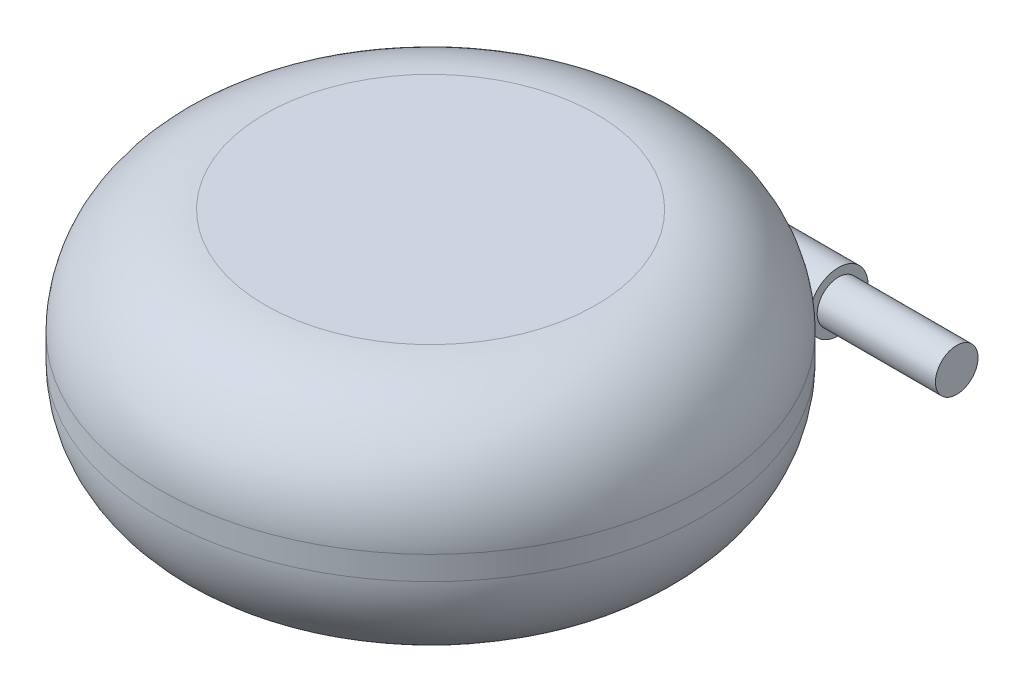
ISO-10303-21;
HEADER;
FILE_DESCRIPTION(('STEP AP214'),'2;1');
FILE_NAME('part.step','',(''),(''),'','','');
FILE_SCHEMA(('AUTOMOTIVE_DESIGN { 1 0 10303 214 1 1 1 1 }'));
ENDSEC;
DATA;
#1=APPLICATION_CONTEXT('core data for automotive mechanical design processes');
#2=APPLICATION_PROTOCOL_DEFINITION('international standard','automotive_design',2000,#1);
#3=PRODUCT_CONTEXT('',#1,'mechanical');
#4=PRODUCT('Part','Part','',(#3));
#5=PRODUCT_RELATED_PRODUCT_CATEGORY('part','',(#4));
#6=PRODUCT_DEFINITION_FORMATION('','',#4);
#7=PRODUCT_DEFINITION_CONTEXT('part definition',#1,'design');
#8=PRODUCT_DEFINITION('design','',#6,#7);
#9=PRODUCT_DEFINITION_SHAPE('','',#8);
#10=(LENGTH_UNIT() NAMED_UNIT(*) SI_UNIT(.MILLI.,.METRE.));
#11=(NAMED_UNIT(*) PLANE_ANGLE_UNIT() SI_UNIT($,.RADIAN.));
#12=(NAMED_UNIT(*) SI_UNIT($,.STERADIAN.) SOLID_ANGLE_UNIT());
#13=UNCERTAINTY_MEASURE_WITH_UNIT(LENGTH_MEASURE(1.E-05),#10,'distance_accuracy_value','');
#14=(GEOMETRIC_REPRESENTATION_CONTEXT(3) GLOBAL_UNCERTAINTY_ASSIGNED_CONTEXT((#13)) GLOBAL_UNIT_ASSIGNED_CONTEXT((#10,
#11,#12)) REPRESENTATION_CONTEXT('',''));
#15=CARTESIAN_POINT('',(0.,0.,0.));
#16=DIRECTION('',(0.,0.,1.));
#17=DIRECTION('',(1.,0.,0.));
#18=AXIS2_PLACEMENT_3D('',#15,#16,#17);
#19=CARTESIAN_POINT('',(0.,25.4,0.));
#20=DIRECTION('',(0.,-1.,0.));
#21=DIRECTION('',(0.,0.,-1.));
#22=AXIS2_PLACEMENT_3D('',#19,#20,#21);
#23=CYLINDRICAL_SURFACE('',#22,29.21);
#24=CARTESIAN_POINT('',(3.92616926060471,11.43,-28.944935566297));
#25=CARTESIAN_POINT('',(3.60195765436434,11.5307722174648,-28.9889065607725));
#26=CARTESIAN_POINT('',(3.27755262590465,11.6331527463692,-29.0273680237138));
#27=CARTESIAN_POINT('',(2.62836930310854,11.840333615523,-29.0933381504677));
#28=CARTESIAN_POINT('',(2.30359097898774,11.9451341637457,-29.1208458691954));
#29=CARTESIAN_POINT('',(1.33025392118025,12.261471413767,-29.1869291914609));
#30=CARTESIAN_POINT('',(0.681242292835413,12.4754017737684,-29.2092610030297));
#31=CARTESIAN_POINT('',(0.0216419840860282,12.6928648511343,-29.2099939857423));
#32=CARTESIAN_POINT('',(0.010820957773101,12.6964324379152,-29.2099999986938));
#33=CARTESIAN_POINT('',(0.,12.7,-29.21));
#34=B_SPLINE_CURVE_WITH_KNOTS('',3,(#24,#25,#26,#27,#28,#29,#30,#31,#32,#33),.UNSPECIFIED.,.F.,
.F.,(4,2,2,2,4),(0.,1.02689661284147,2.05388180673237,4.10325813930052,4.13744001059826),.UNSPECIFIED.);
#35=CARTESIAN_POINT('',(3.92616926060471,11.43,-28.944935566297));
#36=VERTEX_POINT('',#35);
#37=CARTESIAN_POINT('',(0.,12.7,-29.21));
#38=VERTEX_POINT('',#37);
#39=EDGE_CURVE('E149',#36,#38,#34,.T.);
#40=ORIENTED_EDGE('',*,*,#39,.F.);
#41=CARTESIAN_POINT('',(0.,11.43,0.));
#42=DIRECTION('',(0.,1.,0.));
#43=DIRECTION('',(0.,0.,1.));
#44=AXIS2_PLACEMENT_3D('',#41,#42,#43);
#45=CIRCLE('',#44,29.21);
#46=CARTESIAN_POINT('',(17.78,11.43,-23.1753252404362));
#47=VERTEX_POINT('',#46);
#48=EDGE_CURVE('E87',#36,#47,#45,.T.);
#49=ORIENTED_EDGE('',*,*,#48,.T.);
#50=DIRECTION('',(0.,-1.,0.));
#51=VECTOR('',#50,1.);
#52=CARTESIAN_POINT('',(17.78,25.4,-23.1753252404362));
#53=LINE('',#52,#51);
#54=CARTESIAN_POINT('',(17.78,13.9699999999993,-23.1753252404366));
#55=VERTEX_POINT('',#54);
#56=EDGE_CURVE('E91',#47,#55,#53,.F.);
#57=ORIENTED_EDGE('',*,*,#56,.T.);
#58=CARTESIAN_POINT('',(0.,13.97,0.));
#59=DIRECTION('',(0.,1.,0.));
#60=DIRECTION('',(0.,0.,1.));
#61=AXIS2_PLACEMENT_3D('',#58,#59,#60);
#62=CIRCLE('',#61,29.21);
#63=CARTESIAN_POINT('',(3.92616926062342,13.97,-28.9449355662944));
#64=VERTEX_POINT('',#63);
#65=EDGE_CURVE('E82',#55,#64,#62,.F.);
#66=ORIENTED_EDGE('',*,*,#65,.T.);
#67=CARTESIAN_POINT('',(3.92616926060471,13.97,-28.944935566297));
#68=CARTESIAN_POINT('',(3.60195765436434,13.8692277825352,-28.9889065607725));
#69=CARTESIAN_POINT('',(3.27755262590465,13.7668472536307,-29.0273680237138));
#70=CARTESIAN_POINT('',(2.62836930310854,13.559666384477,-29.0933381504677));
#71=CARTESIAN_POINT('',(2.30359097898774,13.4548658362543,-29.1208458691954));
#72=CARTESIAN_POINT('',(1.33025392118025,13.138528586233,-29.1869291914609));
#73=CARTESIAN_POINT('',(0.681242292835413,12.9245982262316,-29.2092610030297));
#74=CARTESIAN_POINT('',(0.0216419840860282,12.7071351488657,-29.2099939857423));
#75=CARTESIAN_POINT('',(0.010820957773101,12.7035675620848,-29.2099999986938));
#76=CARTESIAN_POINT('',(0.,12.7,-29.21));
#77=B_SPLINE_CURVE_WITH_KNOTS('',3,(#67,#68,#69,#70,#71,#72,#73,#74,#75,#76),.UNSPECIFIED.,.F.,
.F.,(4,2,2,2,4),(0.,1.02689661284147,2.05388180673237,4.10325813930052,4.13744001059826),.UNSPECIFIED.);
#78=EDGE_CURVE('E60',#38,#64,#77,.F.);
#79=ORIENTED_EDGE('',*,*,#78,.F.);
#80=EDGE_LOOP('',(#40,#49,#57,#66,#79));
#81=FACE_BOUND('',#80,.T.);
#82=ADVANCED_FACE('F38',(#81),#23,.T.);
#83=CARTESIAN_POINT('',(0.,11.43,0.));
#84=DIRECTION('',(0.,1.,0.));
#85=DIRECTION('',(0.,0.,1.));
#86=AXIS2_PLACEMENT_3D('',#83,#84,#85);
#87=TOROIDAL_SURFACE('',#86,17.78,11.43);
#88=CARTESIAN_POINT('',(0.,0.,0.));
#89=DIRECTION('',(0.,1.,0.));
#90=DIRECTION('',(0.,0.,1.));
#91=AXIS2_PLACEMENT_3D('',#88,#89,#90);
#92=CIRCLE('',#91,17.78);
#93=CARTESIAN_POINT('',(0.,0.,17.78));
#94=VERTEX_POINT('',#93);
#95=EDGE_CURVE('E104',#94,#94,#92,.F.);
#96=ORIENTED_EDGE('',*,*,#95,.F.);
#97=EDGE_LOOP('',(#96));
#98=FACE_BOUND('',#97,.T.);
#99=ORIENTED_EDGE('',*,*,#48,.F.);
#100=CARTESIAN_POINT('',(3.92552574625474,11.4302,-28.9450228452711));
#101=CARTESIAN_POINT('',(4.05108640018269,11.3911698789955,-28.9279958959633));
#102=CARTESIAN_POINT('',(4.17645958159885,11.3519854102864,-28.9099587190273));
#103=CARTESIAN_POINT('',(4.4268781137153,11.273553404963,-28.8718593048638));
#104=CARTESIAN_POINT('',(4.55192346443366,11.2343058683521,-28.851797067748));
#105=CARTESIAN_POINT('',(4.92664789262086,11.1168341352201,-28.7885642643501));
#106=CARTESIAN_POINT('',(5.17590587383543,11.0388837991285,-28.7423488907933));
#107=CARTESIAN_POINT('',(5.67378975538933,10.8851620794979,-28.6418060720515));
#108=CARTESIAN_POINT('',(5.92241457113218,10.8093933595209,-28.5874691736517));
#109=CARTESIAN_POINT('',(6.4188355795898,10.6613713400608,-28.4708782457041));
#110=CARTESIAN_POINT('',(6.66663179549848,10.5891179413976,-28.4086244397003));
#111=CARTESIAN_POINT('',(7.41709283763335,10.3769496186476,-28.2080860630323));
#112=CARTESIAN_POINT('',(7.91864411673318,10.2442323217533,-28.0576863787841));
#113=CARTESIAN_POINT('',(8.91818487195184,10.005953848194,-27.7274068169359));
#114=CARTESIAN_POINT('',(9.41617644176914,9.9003751648035,-27.5475460674815));
#115=CARTESIAN_POINT('',(10.2744868124693,9.74766322644588,-27.2133089100385));
#116=CARTESIAN_POINT('',(10.6357788070321,9.69244761134748,-27.0651061317577));
#117=CARTESIAN_POINT('',(11.3556815945134,9.60372271325457,-26.7558259920952));
#118=CARTESIAN_POINT('',(11.7142915924899,9.57021963199367,-26.5947449670559));
#119=CARTESIAN_POINT('',(12.4250740012472,9.52876794327125,-26.2624930135376));
#120=CARTESIAN_POINT('',(12.7772747139635,9.52062470289164,-26.0914092524417));
#121=CARTESIAN_POINT('',(13.3014527770843,9.53055331168547,-25.8277796501875));
#122=CARTESIAN_POINT('',(13.4754531960431,9.53754938963647,-25.738756471056));
#123=CARTESIAN_POINT('',(13.8218336721142,9.55963098757777,-25.5586085566507));
#124=CARTESIAN_POINT('',(13.9942139922557,9.57471517051399,-25.4674841711119));
#125=CARTESIAN_POINT('',(14.3130722780695,9.61107762983457,-25.2962609053881));
#126=CARTESIAN_POINT('',(14.4598086051806,9.63119807594564,-25.2163975643567));
#127=CARTESIAN_POINT('',(14.7514668747602,9.67868377143776,-25.0555588080383));
#128=CARTESIAN_POINT('',(14.8963891495962,9.70604767271937,-24.9745836023396));
#129=CARTESIAN_POINT('',(15.1848927929873,9.76898517828005,-24.8112831722043));
#130=CARTESIAN_POINT('',(15.3284606471263,9.80460769730619,-24.7289527324918));
#131=CARTESIAN_POINT('',(15.6127439963738,9.88493381078193,-24.5637889410336));
#132=CARTESIAN_POINT('',(15.7534597881896,9.92963645521448,-24.4809556427788));
#133=CARTESIAN_POINT('',(16.0335557626491,10.0301738293703,-24.3138590620681));
#134=CARTESIAN_POINT('',(16.1728736142183,10.0861832424698,-24.2295951743404));
#135=CARTESIAN_POINT('',(16.4465353364441,10.2105129782957,-24.061676129305));
#136=CARTESIAN_POINT('',(16.5808753756678,10.2788425559612,-23.9780214791476));
#137=CARTESIAN_POINT('',(16.8410406949257,10.4290144946812,-23.8133927977495));
#138=CARTESIAN_POINT('',(16.9669439061263,10.5106985281358,-23.7323993232885));
#139=CARTESIAN_POINT('',(17.2086438000348,10.6905074363805,-23.5739226140177));
#140=CARTESIAN_POINT('',(17.324462014425,10.7885959100442,-23.4964320794997));
#141=CARTESIAN_POINT('',(17.4967892940223,10.9599573841546,-23.3781531203357));
#142=CARTESIAN_POINT('',(17.5581487505265,11.0269202393878,-23.3353409709082));
#143=CARTESIAN_POINT('',(17.6745106800979,11.1686262927747,-23.252508197648));
#144=CARTESIAN_POINT('',(17.7294669961113,11.2434193890516,-23.212508579129));
#145=CARTESIAN_POINT('',(17.7802,11.3221965987223,-23.1745310196704));
#146=B_SPLINE_CURVE_WITH_KNOTS('',3,(#100,#101,#102,#103,#104,#105,#106,#107,#108,#109,#110,
#111,#112,#113,#114,#115,#116,#117,#118,#119,#120,#121,#122,#123,#124,#125,#126,#127,#128,#129,
#130,#131,#132,#133,#134,#135,#136,#137,#138,#139,#140,#141,#142,#143,#144,#145),.UNSPECIFIED.,
.F.,.F.,(4,2,2,2,2,2,2,2,2,2,2,2,2,2,2,2,2,2,2,2,2,2,4),(0.,0.397746007675005,0.79549199343065,
1.59101399340722,2.38746927425886,3.18390207116103,4.80296383001874,6.42097851957529,
7.60342931185483,8.78621769792469,9.95990570543432,10.5464875270275,11.1329724099765,
11.6376306847916,12.142195102217,12.649827994991,13.1574078035071,13.6735297771729,
14.1900410906688,14.7008219873252,15.2104841546499,15.5112231722577,15.8140110748564),.UNSPECIFIED.);
#147=CARTESIAN_POINT('',(17.78,11.3218857571805,-23.1746807636675));
#148=VERTEX_POINT('',#147);
#149=EDGE_CURVE('E68',#36,#148,#146,.T.);
#150=ORIENTED_EDGE('',*,*,#149,.T.);
#151=CARTESIAN_POINT('',(17.78,18.0597946331582,-20.4397223271064));
#152=CARTESIAN_POINT('',(17.78,17.8585476812252,-20.6296994778865));
#153=CARTESIAN_POINT('',(17.78,17.6501260729802,-20.8121739394137));
#154=CARTESIAN_POINT('',(17.78,17.2196487850253,-21.1605128778233));
#155=CARTESIAN_POINT('',(17.78,16.9975852656496,-21.3263676569962));
#156=CARTESIAN_POINT('',(17.78,16.5400849272166,-21.6401113619725));
#157=CARTESIAN_POINT('',(17.78,16.3046097388053,-21.787944506733));
#158=CARTESIAN_POINT('',(17.78,15.8221523575884,-22.0633837066044));
#159=CARTESIAN_POINT('',(17.78,15.5751723468332,-22.1909935772935));
#160=CARTESIAN_POINT('',(17.78,15.0701707729468,-22.4249408299323));
#161=CARTESIAN_POINT('',(17.78,14.8121107697574,-22.5311954158853));
#162=CARTESIAN_POINT('',(17.78,14.2876075077343,-22.7204613001433));
#163=CARTESIAN_POINT('',(17.78,14.02116483072,-22.803474207651));
#164=CARTESIAN_POINT('',(17.78,13.4823284100926,-22.9450397353126));
#165=CARTESIAN_POINT('',(17.78,13.2099454536155,-23.0036333462965));
#166=CARTESIAN_POINT('',(17.78,12.6609796933647,-23.095751453996));
#167=CARTESIAN_POINT('',(17.78,12.3843971947038,-23.1292777631393));
#168=CARTESIAN_POINT('',(17.78,11.8456519509514,-23.1695773718861));
#169=CARTESIAN_POINT('',(17.78,11.5835972300852,-23.1778073774792));
#170=CARTESIAN_POINT('',(17.78,11.0597645250506,-23.1715492599112));
#171=CARTESIAN_POINT('',(17.78,10.7979865311543,-23.1570619638242));
#172=CARTESIAN_POINT('',(17.78,10.2765588526138,-23.1055416289804));
#173=CARTESIAN_POINT('',(17.78,10.0169100555342,-23.0684996286581));
#174=CARTESIAN_POINT('',(17.78,9.50174283087533,-22.9723222476589));
#175=CARTESIAN_POINT('',(17.78,9.2462243955626,-22.9131869083529));
#176=CARTESIAN_POINT('',(17.78,8.74675426915572,-22.7751030892662));
#177=CARTESIAN_POINT('',(17.78,8.50267170022041,-22.6966267169812));
#178=CARTESIAN_POINT('',(17.78,8.02169580373772,-22.5201264148578));
#179=CARTESIAN_POINT('',(17.78,7.78480232906086,-22.422102885376));
#180=CARTESIAN_POINT('',(17.78,7.31963631949541,-22.2075955958716));
#181=CARTESIAN_POINT('',(17.78,7.09136093503144,-22.0911180050766));
#182=CARTESIAN_POINT('',(17.78,6.6444193238078,-21.8408138372129));
#183=CARTESIAN_POINT('',(17.78,6.42575728760095,-21.706979792757));
#184=CARTESIAN_POINT('',(17.78,5.98645667126053,-21.4148679639952));
#185=CARTESIAN_POINT('',(17.78,5.76646915498793,-21.2556115246836));
#186=CARTESIAN_POINT('',(17.78,5.33943846801748,-20.9207586566877));
#187=CARTESIAN_POINT('',(17.78,5.13239153365918,-20.7451670162809));
#188=CARTESIAN_POINT('',(17.78,4.73171084821083,-20.3791315678712));
#189=CARTESIAN_POINT('',(17.78,4.53808381037859,-20.1886804262798));
#190=CARTESIAN_POINT('',(17.78,4.16479849348309,-19.7946503534432));
#191=CARTESIAN_POINT('',(17.78,3.9851371865638,-19.5910742853703));
#192=CARTESIAN_POINT('',(17.78,3.64638602299729,-19.1801524933876));
#193=CARTESIAN_POINT('',(17.78,3.48677821681939,-18.9732321901621));
#194=CARTESIAN_POINT('',(17.78,3.18105392786381,-18.5505719114545));
#195=CARTESIAN_POINT('',(17.78,3.03489912041334,-18.3348596861444));
#196=CARTESIAN_POINT('',(17.78,2.8952053668418,-18.1150998587796));
#197=B_SPLINE_CURVE_WITH_KNOTS('',3,(#151,#152,#153,#154,#155,#156,#157,#158,#159,#160,#161,
#162,#163,#164,#165,#166,#167,#168,#169,#170,#171,#172,#173,#174,#175,#176,#177,#178,#179,#180,
#181,#182,#183,#184,#185,#186,#187,#188,#189,#190,#191,#192,#193,#194,#195,#196),.UNSPECIFIED.,
.F.,.F.,(4,2,2,2,2,2,2,2,2,2,2,2,2,2,2,2,2,2,2,2,2,2,4),(0.,0.830162875523506,1.66080737056599,
2.49396091575616,3.32695708005457,4.16312304334713,4.99923109802361,5.83392993241793,
6.66856841019311,7.45414682175353,8.23969663323823,9.02555876777168,9.81141943074314,
10.5797250537606,11.3480149422858,12.1160485298951,12.8844136570008,13.6983219852141,
14.5119924827215,15.3260671213399,16.1399647684502,16.9234362917683,17.7046019266293),.UNSPECIFIED.);
#198=EDGE_CURVE('E94',#47,#148,#197,.T.);
#199=ORIENTED_EDGE('',*,*,#198,.F.);
#200=EDGE_LOOP('',(#99,#150,#199));
#201=FACE_BOUND('',#200,.T.);
#202=ADVANCED_FACE('F136',(#98,#201),#87,.T.);
#203=CARTESIAN_POINT('',(0.,13.97,0.));
#204=DIRECTION('',(0.,1.,0.));
#205=DIRECTION('',(0.,0.,1.));
#206=AXIS2_PLACEMENT_3D('',#203,#204,#205);
#207=TOROIDAL_SURFACE('',#206,17.78,11.43);
#208=CARTESIAN_POINT('',(0.,25.4,0.));
#209=DIRECTION('',(0.,1.,0.));
#210=DIRECTION('',(0.,0.,1.));
#211=AXIS2_PLACEMENT_3D('',#208,#209,#210);
#212=CIRCLE('',#211,17.78);
#213=CARTESIAN_POINT('',(0.,25.4,17.78));
#214=VERTEX_POINT('',#213);
#215=EDGE_CURVE('E101',#214,#214,#212,.T.);
#216=ORIENTED_EDGE('',*,*,#215,.F.);
#217=EDGE_LOOP('',(#216));
#218=FACE_BOUND('',#217,.T.);
#219=CARTESIAN_POINT('',(17.78,22.5047946331582,-18.1150998587796));
#220=CARTESIAN_POINT('',(17.78,22.3363672396599,-18.3800905529028));
#221=CARTESIAN_POINT('',(17.78,22.158505480999,-18.6392157378025));
#222=CARTESIAN_POINT('',(17.78,21.7837423546993,-19.143665379399));
#223=CARTESIAN_POINT('',(17.78,21.5868233685023,-19.3889767272507));
#224=CARTESIAN_POINT('',(17.78,21.1726759237254,-19.8648497206013));
#225=CARTESIAN_POINT('',(17.78,20.9553176001725,-20.0952988354232));
#226=CARTESIAN_POINT('',(17.78,20.501982002134,-20.5370092627018));
#227=CARTESIAN_POINT('',(17.78,20.2660099412876,-20.7482759126841));
#228=CARTESIAN_POINT('',(17.78,19.774833938451,-21.1503003874314));
#229=CARTESIAN_POINT('',(17.78,19.5195255602328,-21.340930998133));
#230=CARTESIAN_POINT('',(17.78,18.9922411016043,-21.6976829832473));
#231=CARTESIAN_POINT('',(17.78,18.7202633126122,-21.8638018392869));
#232=CARTESIAN_POINT('',(17.78,18.1623918932575,-22.1685703216689));
#233=CARTESIAN_POINT('',(17.78,17.8765439855303,-22.3073034550766));
#234=CARTESIAN_POINT('',(17.78,17.2925019775972,-22.5557209406052));
#235=CARTESIAN_POINT('',(17.78,16.9943099645672,-22.6654101805385));
#236=CARTESIAN_POINT('',(17.78,16.4238123294974,-22.8428787828015));
#237=CARTESIAN_POINT('',(17.78,16.1525611012171,-22.9140604906197));
#238=CARTESIAN_POINT('',(17.78,15.6046989277282,-23.0313890982121));
#239=CARTESIAN_POINT('',(17.78,15.3280884279096,-23.0775380692028));
#240=CARTESIAN_POINT('',(17.78,14.7717184736404,-23.1441610108929));
#241=CARTESIAN_POINT('',(17.78,14.4919582209951,-23.1646283186608));
#242=CARTESIAN_POINT('',(17.78,13.9317487327092,-23.1795712078419));
#243=CARTESIAN_POINT('',(17.78,13.651299531646,-23.1740480680799));
#244=CARTESIAN_POINT('',(17.78,13.1151364555648,-23.1386185482243));
#245=CARTESIAN_POINT('',(17.78,12.8592851057327,-23.110754757771));
#246=CARTESIAN_POINT('',(17.78,12.3508461483075,-23.0335483193623));
#247=CARTESIAN_POINT('',(17.78,12.0982584997297,-22.9842059413995));
#248=CARTESIAN_POINT('',(17.78,11.5980909442008,-22.8646250957791));
#249=CARTESIAN_POINT('',(17.78,11.3505109991519,-22.7943867871581));
#250=CARTESIAN_POINT('',(17.78,10.8619652530002,-22.6338203913781));
#251=CARTESIAN_POINT('',(17.78,10.6209994443239,-22.5434923272241));
#252=CARTESIAN_POINT('',(17.78,10.1445381419913,-22.3426498434336));
#253=CARTESIAN_POINT('',(17.78,9.90913124875541,-22.2319255390924));
#254=CARTESIAN_POINT('',(17.78,9.44784826182219,-21.9921445854972));
#255=CARTESIAN_POINT('',(17.78,9.22197260942544,-21.8630870886137));
#256=CARTESIAN_POINT('',(17.78,8.78108106316451,-21.5880934196861));
#257=CARTESIAN_POINT('',(17.78,8.56605463407181,-21.442174092985));
#258=CARTESIAN_POINT('',(17.78,8.14755203054321,-21.1347702374167));
#259=CARTESIAN_POINT('',(17.78,7.94407106184011,-20.9732922455851));
#260=CARTESIAN_POINT('',(17.78,7.67739570895442,-20.7455868493618));
#261=CARTESIAN_POINT('',(17.78,7.60884547075702,-20.6855415011379));
#262=CARTESIAN_POINT('',(17.78,7.4733466631774,-20.5638419046985));
#263=CARTESIAN_POINT('',(17.78,7.40639615564012,-20.5021898146633));
#264=CARTESIAN_POINT('',(17.78,7.34020536684179,-20.4397223271064));
#265=B_SPLINE_CURVE_WITH_KNOTS('',3,(#219,#220,#221,#222,#223,#224,#225,#226,#227,#228,#229,
#230,#231,#232,#233,#234,#235,#236,#237,#238,#239,#240,#241,#242,#243,#244,#245,#246,#247,#248,
#249,#250,#251,#252,#253,#254,#255,#256,#257,#258,#259,#260,#261,#262,#263,#264),.UNSPECIFIED.,
.F.,.F.,(4,2,2,2,2,2,2,2,2,2,2,2,2,2,2,2,2,2,2,2,2,2,4),(0.,0.941930635863331,1.88474056779278,
2.83400794574214,3.78301037514271,4.73756477281634,5.69221717460505,6.64391200062028,
7.59544656346336,8.43562663269713,9.27573717455813,10.1160656323075,10.9563527432636,
11.7275360823087,12.4987097276162,13.2698775037577,14.0410443968329,14.8206417900984,
15.6002752395396,16.3791364439223,17.1576718219002,17.4310399144934,17.7040580323518),.UNSPECIFIED.);
#266=CARTESIAN_POINT('',(17.78,14.078114242821,-23.1746807636675));
#267=VERTEX_POINT('',#266);
#268=EDGE_CURVE('E53',#267,#55,#265,.T.);
#269=ORIENTED_EDGE('',*,*,#268,.F.);
#270=CARTESIAN_POINT('',(17.7802,14.0778034012777,-23.1745310196704));
#271=CARTESIAN_POINT('',(17.727670375001,14.1593553884361,-23.2138522358699));
#272=CARTESIAN_POINT('',(17.6706165165389,14.2366528733462,-23.2553404990844));
#273=CARTESIAN_POINT('',(17.5494581400866,14.3830665100726,-23.3414605478507));
#274=CARTESIAN_POINT('',(17.4853801999774,14.4522115784799,-23.3860802685672));
#275=CARTESIAN_POINT('',(17.3527388894321,14.5822772896195,-23.4769059643318));
#276=CARTESIAN_POINT('',(17.284254918444,14.6433035170844,-23.5230791537676));
#277=CARTESIAN_POINT('',(17.1430356882162,14.7590292480939,-23.6170291181853));
#278=CARTESIAN_POINT('',(17.0702955823976,14.8137213190834,-23.6648076938419));
#279=CARTESIAN_POINT('',(16.8764477129351,14.9487047055352,-23.7906938502725));
#280=CARTESIAN_POINT('',(16.7527214066434,15.0244452597928,-23.8696490223495));
#281=CARTESIAN_POINT('',(16.4992505960237,15.1632136777658,-24.028921737684));
#282=CARTESIAN_POINT('',(16.3695043868908,15.2262379129237,-24.1092396627307));
#283=CARTESIAN_POINT('',(16.1043509287449,15.3418388415601,-24.2711149062167));
#284=CARTESIAN_POINT('',(15.9689024215848,15.3943135207934,-24.3526768172248));
#285=CARTESIAN_POINT('',(15.6945323540136,15.4895032613676,-24.5157214741316));
#286=CARTESIAN_POINT('',(15.5556094301153,15.5322144222987,-24.5972041754887));
#287=CARTESIAN_POINT('',(15.2810053068153,15.6073544925835,-24.7562054661936));
#288=CARTESIAN_POINT('',(15.1454338961061,15.6401406122257,-24.8337465112554));
#289=CARTESIAN_POINT('',(14.8723091600533,15.6985535229034,-24.9880515478137));
#290=CARTESIAN_POINT('',(14.7347554830134,15.7241790266304,-25.0648153972012));
#291=CARTESIAN_POINT('',(14.3195339489723,15.7913412126554,-25.293667805357));
#292=CARTESIAN_POINT('',(14.0394264021537,15.8231319504677,-25.4442472381315));
#293=CARTESIAN_POINT('',(13.4753746703986,15.8647327017844,-25.7396047394994));
#294=CARTESIAN_POINT('',(13.1914385445829,15.8745832828135,-25.8843930281341));
#295=CARTESIAN_POINT('',(12.6202487877706,15.8753908574562,-26.1674847373519));
#296=CARTESIAN_POINT('',(12.3329941681845,15.8663420685913,-26.3057861599668));
#297=CARTESIAN_POINT('',(11.7972038846207,15.8341616639265,-26.5557504660795));
#298=CARTESIAN_POINT('',(11.5489892328497,15.8132226812532,-26.6683993584519));
#299=CARTESIAN_POINT('',(11.0510782876509,15.7604222521661,-26.8877393415967));
#300=CARTESIAN_POINT('',(10.8013818104663,15.7285594220793,-26.9944296756343));
#301=CARTESIAN_POINT('',(10.0502155133062,15.6182440666857,-27.3049469522345));
#302=CARTESIAN_POINT('',(9.54685305527569,15.5250774333643,-27.4991336901993));
#303=CARTESIAN_POINT('',(8.53590931181866,15.307561468126,-27.8585607130303));
#304=CARTESIAN_POINT('',(8.02832331250524,15.1831709005607,-28.0237622247023));
#305=CARTESIAN_POINT('',(7.26476249602872,14.9793717531796,-28.2475280873072));
#306=CARTESIAN_POINT('',(7.00991642624295,14.9085815589667,-28.31810198254));
#307=CARTESIAN_POINT('',(6.49940917588049,14.7623594986096,-28.4510003235647));
#308=CARTESIAN_POINT('',(6.24374801663504,14.6869277530064,-28.5133249834569));
#309=CARTESIAN_POINT('',(5.64524115298023,14.5066164820597,-28.6490776846762));
#310=CARTESIAN_POINT('',(5.30204254064144,14.4003780293827,-28.7191719206378));
#311=CARTESIAN_POINT('',(4.7863865878816,14.2392520782365,-28.8126200388028));
#312=CARTESIAN_POINT('',(4.6146519198464,14.1853421680299,-28.8417807045739));
#313=CARTESIAN_POINT('',(4.27057082547586,14.0774643120507,-28.8962735542255));
#314=CARTESIAN_POINT('',(4.09822432685472,14.0234963599837,-28.9216052692014));
#315=CARTESIAN_POINT('',(3.92552574625474,13.9698,-28.9450228452711));
#316=B_SPLINE_CURVE_WITH_KNOTS('',3,(#270,#271,#272,#273,#274,#275,#276,#277,#278,#279,#280,
#281,#282,#283,#284,#285,#286,#287,#288,#289,#290,#291,#292,#293,#294,#295,#296,#297,#298,#299,
#300,#301,#302,#303,#304,#305,#306,#307,#308,#309,#310,#311,#312,#313,#314,#315),.UNSPECIFIED.,
.F.,.F.,(4,2,2,2,2,2,2,2,2,2,2,2,2,2,2,2,2,2,2,2,2,2,4),(0.,0.313478594041888,0.625809512387325,
0.933567957698427,1.24168394702988,1.73635913328056,2.23117527436886,2.73056769670136,
3.23015927308856,3.70871586321421,4.1873584311641,5.14507154171643,6.10101235785636,
7.0572456978699,7.87709623127693,8.69705064974036,10.3375690709985,11.9802655349837,
12.8013710119833,13.6224551738525,14.720178147381,15.2671767552227,15.8142422959705),.UNSPECIFIED.);
#317=EDGE_CURVE('E11',#267,#64,#316,.T.);
#318=ORIENTED_EDGE('',*,*,#317,.T.);
#319=ORIENTED_EDGE('',*,*,#65,.F.);
#320=EDGE_LOOP('',(#269,#318,#319));
#321=FACE_BOUND('',#320,.T.);
#322=ADVANCED_FACE('F40',(#218,#321),#207,.T.);
#323=CARTESIAN_POINT('',(0.,25.4,0.));
#324=DIRECTION('',(0.,1.,0.));
#325=DIRECTION('',(0.,0.,1.));
#326=AXIS2_PLACEMENT_3D('',#323,#324,#325);
#327=PLANE('',#326);
#328=ORIENTED_EDGE('',*,*,#215,.T.);
#329=EDGE_LOOP('',(#328));
#330=FACE_BOUND('',#329,.T.);
#331=ADVANCED_FACE('F202',(#330),#327,.T.);
#332=CARTESIAN_POINT('',(0.,0.,0.));
#333=DIRECTION('',(0.,1.,0.));
#334=DIRECTION('',(0.,0.,1.));
#335=AXIS2_PLACEMENT_3D('',#332,#333,#334);
#336=PLANE('',#335);
#337=ORIENTED_EDGE('',*,*,#95,.T.);
#338=EDGE_LOOP('',(#337));
#339=FACE_BOUND('',#338,.T.);
#340=ADVANCED_FACE('F160',(#339),#336,.F.);
#341=CARTESIAN_POINT('',(17.78,12.7,-26.035));
#342=DIRECTION('',(-1.,0.,0.));
#343=DIRECTION('',(0.,0.,1.));
#344=AXIS2_PLACEMENT_3D('',#341,#342,#343);
#345=CYLINDRICAL_SURFACE('',#344,3.175);
#346=ORIENTED_EDGE('',*,*,#149,.F.);
#347=ORIENTED_EDGE('',*,*,#39,.T.);
#348=ORIENTED_EDGE('',*,*,#78,.T.);
#349=ORIENTED_EDGE('',*,*,#317,.F.);
#350=CARTESIAN_POINT('',(17.78,12.7,-26.035));
#351=DIRECTION('',(1.,0.,0.));
#352=DIRECTION('',(0.,0.,-1.));
#353=AXIS2_PLACEMENT_3D('',#350,#351,#352);
#354=CIRCLE('',#353,3.175);
#355=EDGE_CURVE('E95',#148,#267,#354,.T.);
#356=ORIENTED_EDGE('',*,*,#355,.F.);
#357=EDGE_LOOP('',(#346,#347,#348,#349,#356));
#358=FACE_BOUND('',#357,.T.);
#359=ADVANCED_FACE('F116',(#358),#345,.T.);
#360=CARTESIAN_POINT('',(17.78,12.7,-26.035));
#361=DIRECTION('',(1.,0.,0.));
#362=DIRECTION('',(0.,0.,-1.));
#363=AXIS2_PLACEMENT_3D('',#360,#361,#362);
#364=PLANE('',#363);
#365=CARTESIAN_POINT('',(17.78,12.7,-26.035));
#366=DIRECTION('',(1.,0.,0.));
#367=DIRECTION('',(0.,0.,-1.));
#368=AXIS2_PLACEMENT_3D('',#365,#366,#367);
#369=CIRCLE('',#368,2.286);
#370=CARTESIAN_POINT('',(17.78,12.7,-28.321));
#371=VERTEX_POINT('',#370);
#372=EDGE_CURVE('E166',#371,#371,#369,.T.);
#373=ORIENTED_EDGE('',*,*,#372,.F.);
#374=EDGE_LOOP('',(#373));
#375=FACE_BOUND('',#374,.T.);
#376=ORIENTED_EDGE('',*,*,#56,.F.);
#377=ORIENTED_EDGE('',*,*,#198,.T.);
#378=ORIENTED_EDGE('',*,*,#355,.T.);
#379=ORIENTED_EDGE('',*,*,#268,.T.);
#380=EDGE_LOOP('',(#376,#377,#378,#379));
#381=FACE_BOUND('',#380,.T.);
#382=ADVANCED_FACE('F98',(#375,#381),#364,.T.);
#383=CARTESIAN_POINT('',(30.48,12.7,-26.035));
#384=DIRECTION('',(-1.,0.,0.));
#385=DIRECTION('',(0.,0.,1.));
#386=AXIS2_PLACEMENT_3D('',#383,#384,#385);
#387=CYLINDRICAL_SURFACE('',#386,2.286);
#388=CARTESIAN_POINT('',(30.48,12.7,-26.035));
#389=DIRECTION('',(1.,0.,0.));
#390=DIRECTION('',(0.,0.,-1.));
#391=AXIS2_PLACEMENT_3D('',#388,#389,#390);
#392=CIRCLE('',#391,2.286);
#393=CARTESIAN_POINT('',(30.48,12.7,-28.321));
#394=VERTEX_POINT('',#393);
#395=EDGE_CURVE('E163',#394,#394,#392,.T.);
#396=ORIENTED_EDGE('',*,*,#395,.F.);
#397=EDGE_LOOP('',(#396));
#398=FACE_BOUND('',#397,.T.);
#399=ORIENTED_EDGE('',*,*,#372,.T.);
#400=EDGE_LOOP('',(#399));
#401=FACE_BOUND('',#400,.T.);
#402=ADVANCED_FACE('F115',(#398,#401),#387,.T.);
#403=CARTESIAN_POINT('',(30.48,12.7,-26.035));
#404=DIRECTION('',(1.,0.,0.));
#405=DIRECTION('',(0.,0.,-1.));
#406=AXIS2_PLACEMENT_3D('',#403,#404,#405);
#407=PLANE('',#406);
#408=ORIENTED_EDGE('',*,*,#395,.T.);
#409=EDGE_LOOP('',(#408));
#410=FACE_BOUND('',#409,.T.);
#411=ADVANCED_FACE('F174',(#410),#407,.T.);
#412=CLOSED_SHELL('',(#82,#202,#322,#331,#340,#359,#382,#402,#411));
#413=MANIFOLD_SOLID_BREP('B2',#412);
#414=ADVANCED_BREP_SHAPE_REPRESENTATION('',(#18,#413),#14);
#415=SHAPE_DEFINITION_REPRESENTATION(#9,#414);
ENDSEC;
END-ISO-10303-21;
